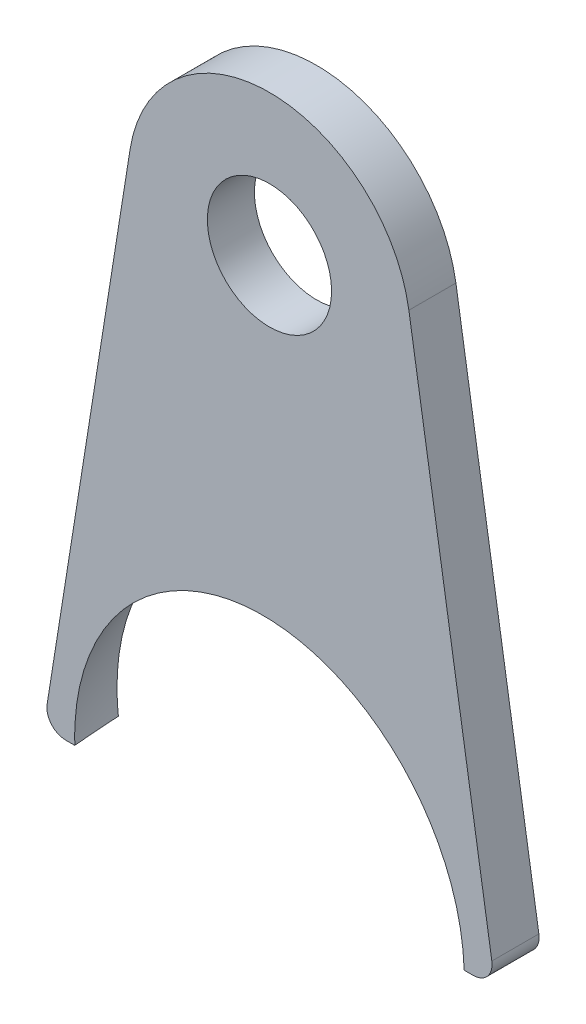
ISO-10303-21;
HEADER;
FILE_DESCRIPTION(('STEP AP214'),'2;1');
FILE_NAME('part.step','',(''),(''),'','','');
FILE_SCHEMA(('AUTOMOTIVE_DESIGN { 1 0 10303 214 1 1 1 1 }'));
ENDSEC;
DATA;
#1=APPLICATION_CONTEXT('core data for automotive mechanical design processes');
#2=APPLICATION_PROTOCOL_DEFINITION('international standard','automotive_design',2000,#1);
#3=PRODUCT_CONTEXT('',#1,'mechanical');
#4=PRODUCT('Part','Part','',(#3));
#5=PRODUCT_RELATED_PRODUCT_CATEGORY('part','',(#4));
#6=PRODUCT_DEFINITION_FORMATION('','',#4);
#7=PRODUCT_DEFINITION_CONTEXT('part definition',#1,'design');
#8=PRODUCT_DEFINITION('design','',#6,#7);
#9=PRODUCT_DEFINITION_SHAPE('','',#8);
#10=(LENGTH_UNIT() NAMED_UNIT(*) SI_UNIT(.MILLI.,.METRE.));
#11=(NAMED_UNIT(*) PLANE_ANGLE_UNIT() SI_UNIT($,.RADIAN.));
#12=(NAMED_UNIT(*) SI_UNIT($,.STERADIAN.) SOLID_ANGLE_UNIT());
#13=UNCERTAINTY_MEASURE_WITH_UNIT(LENGTH_MEASURE(1.E-05),#10,'distance_accuracy_value','');
#14=(GEOMETRIC_REPRESENTATION_CONTEXT(3) GLOBAL_UNCERTAINTY_ASSIGNED_CONTEXT((#13)) GLOBAL_UNIT_ASSIGNED_CONTEXT((#10,
#11,#12)) REPRESENTATION_CONTEXT('',''));
#15=CARTESIAN_POINT('',(0.,0.,0.));
#16=DIRECTION('',(0.,0.,1.));
#17=DIRECTION('',(1.,0.,0.));
#18=AXIS2_PLACEMENT_3D('',#15,#16,#17);
#19=CARTESIAN_POINT('',(0.,-35.211766,-3.175));
#20=DIRECTION('',(0.,1.,0.));
#21=DIRECTION('',(-1.,0.,0.));
#22=AXIS2_PLACEMENT_3D('',#19,#20,#21);
#23=PLANE('',#22);
#24=DIRECTION('',(1.,0.,0.));
#25=VECTOR('',#24,1.);
#26=CARTESIAN_POINT('',(0.,-35.211766,0.));
#27=LINE('',#26,#25);
#28=CARTESIAN_POINT('',(13.1394340026446,-35.211766,0.));
#29=VERTEX_POINT('',#28);
#30=CARTESIAN_POINT('',(13.7522496650488,-35.211766,0.));
#31=VERTEX_POINT('',#30);
#32=EDGE_CURVE('E131',#29,#31,#27,.T.);
#33=ORIENTED_EDGE('',*,*,#32,.F.);
#34=CARTESIAN_POINT('',(0.00476535947638301,-35.211766,0.0475119253614542));
#35=DIRECTION('',(0.,-1.,0.));
#36=DIRECTION('',(0.0997974651310145,0.,0.995007771805539));
#37=AXIS2_PLACEMENT_3D('',#34,#35,#36);
#38=ELLIPSE('',#37,38.1911531206193,13.081);
#39=CARTESIAN_POINT('',(12.8114151936818,-35.211766,-3.175));
#40=VERTEX_POINT('',#39);
#41=EDGE_CURVE('E114',#29,#40,#38,.F.);
#42=ORIENTED_EDGE('',*,*,#41,.T.);
#43=DIRECTION('',(1.,0.,0.));
#44=VECTOR('',#43,1.);
#45=CARTESIAN_POINT('',(0.,-35.211766,-3.175));
#46=LINE('',#45,#44);
#47=CARTESIAN_POINT('',(13.7522496650488,-35.211766,-3.175));
#48=VERTEX_POINT('',#47);
#49=EDGE_CURVE('E178',#40,#48,#46,.T.);
#50=ORIENTED_EDGE('',*,*,#49,.T.);
#51=DIRECTION('',(0.,0.,1.));
#52=VECTOR('',#51,1.);
#53=CARTESIAN_POINT('',(13.7522496650488,-35.211766,-3.175));
#54=LINE('',#53,#52);
#55=EDGE_CURVE('E11',#31,#48,#54,.F.);
#56=ORIENTED_EDGE('',*,*,#55,.F.);
#57=EDGE_LOOP('',(#33,#42,#50,#56));
#58=FACE_BOUND('',#57,.T.);
#59=ADVANCED_FACE('F43',(#58),#23,.F.);
#60=CARTESIAN_POINT('',(-9.40696698253595,1.49485691271059,-3.175));
#61=DIRECTION('',(-0.987608082156004,0.156940358289825,0.));
#62=DIRECTION('',(-0.156940358289825,-0.987608082156004,0.));
#63=AXIS2_PLACEMENT_3D('',#60,#61,#62);
#64=PLANE('',#63);
#65=DIRECTION('',(0.156940358289825,0.987608082156004,0.));
#66=VECTOR('',#65,1.);
#67=CARTESIAN_POINT('',(-9.40696698253595,1.49485691271059,0.));
#68=LINE('',#67,#66);
#69=CARTESIAN_POINT('',(-15.006511929387,-33.7424517449719,0.));
#70=VERTEX_POINT('',#69);
#71=CARTESIAN_POINT('',(-9.40696698253595,1.49485691271059,0.));
#72=VERTEX_POINT('',#71);
#73=EDGE_CURVE('E138',#70,#72,#68,.T.);
#74=ORIENTED_EDGE('',*,*,#73,.T.);
#75=DIRECTION('',(0.,0.,1.));
#76=VECTOR('',#75,1.);
#77=CARTESIAN_POINT('',(-9.40696698253595,1.49485691271059,-3.175));
#78=LINE('',#77,#76);
#79=CARTESIAN_POINT('',(-9.40696698253595,1.49485691271059,-3.175));
#80=VERTEX_POINT('',#79);
#81=EDGE_CURVE('E129',#80,#72,#78,.T.);
#82=ORIENTED_EDGE('',*,*,#81,.F.);
#83=DIRECTION('',(0.156940358289825,0.987608082156004,0.));
#84=VECTOR('',#83,1.);
#85=CARTESIAN_POINT('',(-9.40696698253595,1.49485691271059,-3.175));
#86=LINE('',#85,#84);
#87=CARTESIAN_POINT('',(-15.006511929387,-33.7424517449719,-3.175));
#88=VERTEX_POINT('',#87);
#89=EDGE_CURVE('E179',#88,#80,#86,.T.);
#90=ORIENTED_EDGE('',*,*,#89,.F.);
#91=DIRECTION('',(0.,0.,1.));
#92=VECTOR('',#91,1.);
#93=CARTESIAN_POINT('',(-15.006511929387,-33.7424517449719,-3.175));
#94=LINE('',#93,#92);
#95=EDGE_CURVE('E151',#70,#88,#94,.F.);
#96=ORIENTED_EDGE('',*,*,#95,.F.);
#97=EDGE_LOOP('',(#74,#82,#90,#96));
#98=FACE_BOUND('',#97,.T.);
#99=ADVANCED_FACE('F189',(#98),#64,.T.);
#100=CARTESIAN_POINT('',(-13.7522496650488,-35.211766,-3.175));
#101=VERTEX_POINT('',#100);
#102=CARTESIAN_POINT('',(-13.3718002828236,-35.211766,-3.175));
#103=VERTEX_POINT('',#102);
#104=EDGE_CURVE('E134',#101,#103,#46,.T.);
#105=ORIENTED_EDGE('',*,*,#104,.T.);
#106=CARTESIAN_POINT('',(-13.1383059825689,-35.211766,0.));
#107=VERTEX_POINT('',#106);
#108=EDGE_CURVE('E111',#103,#107,#38,.F.);
#109=ORIENTED_EDGE('',*,*,#108,.T.);
#110=CARTESIAN_POINT('',(-13.7522496650488,-35.211766,0.));
#111=VERTEX_POINT('',#110);
#112=EDGE_CURVE('E120',#111,#107,#27,.T.);
#113=ORIENTED_EDGE('',*,*,#112,.F.);
#114=DIRECTION('',(0.,0.,1.));
#115=VECTOR('',#114,1.);
#116=CARTESIAN_POINT('',(-13.7522496650488,-35.211766,0.));
#117=LINE('',#116,#115);
#118=EDGE_CURVE('E142',#101,#111,#117,.T.);
#119=ORIENTED_EDGE('',*,*,#118,.F.);
#120=EDGE_LOOP('',(#105,#109,#113,#119));
#121=FACE_BOUND('',#120,.T.);
#122=ADVANCED_FACE('F132',(#121),#23,.F.);
#123=CARTESIAN_POINT('',(9.40696698253595,1.49485691271059,-3.175));
#124=DIRECTION('',(-0.987608082156004,-0.156940358289826,0.));
#125=DIRECTION('',(0.156940358289826,-0.987608082156004,0.));
#126=AXIS2_PLACEMENT_3D('',#123,#124,#125);
#127=PLANE('',#126);
#128=DIRECTION('',(-0.156940358289826,0.987608082156004,0.));
#129=VECTOR('',#128,1.);
#130=CARTESIAN_POINT('',(9.40696698253595,1.49485691271059,-3.175));
#131=LINE('',#130,#129);
#132=CARTESIAN_POINT('',(15.006511929387,-33.7424517449719,-3.175));
#133=VERTEX_POINT('',#132);
#134=CARTESIAN_POINT('',(9.40696698253595,1.49485691271059,-3.175));
#135=VERTEX_POINT('',#134);
#136=EDGE_CURVE('E176',#133,#135,#131,.T.);
#137=ORIENTED_EDGE('',*,*,#136,.T.);
#138=DIRECTION('',(0.,0.,1.));
#139=VECTOR('',#138,1.);
#140=CARTESIAN_POINT('',(9.40696698253595,1.49485691271059,-3.175));
#141=LINE('',#140,#139);
#142=CARTESIAN_POINT('',(9.40696698253595,1.49485691271059,0.));
#143=VERTEX_POINT('',#142);
#144=EDGE_CURVE('E164',#135,#143,#141,.T.);
#145=ORIENTED_EDGE('',*,*,#144,.T.);
#146=DIRECTION('',(-0.156940358289826,0.987608082156004,0.));
#147=VECTOR('',#146,1.);
#148=CARTESIAN_POINT('',(9.40696698253595,1.49485691271059,0.));
#149=LINE('',#148,#147);
#150=CARTESIAN_POINT('',(15.006511929387,-33.7424517449719,0.));
#151=VERTEX_POINT('',#150);
#152=EDGE_CURVE('E128',#151,#143,#149,.T.);
#153=ORIENTED_EDGE('',*,*,#152,.F.);
#154=DIRECTION('',(0.,0.,1.));
#155=VECTOR('',#154,1.);
#156=CARTESIAN_POINT('',(15.006511929387,-33.7424517449719,-3.175));
#157=LINE('',#156,#155);
#158=EDGE_CURVE('E51',#133,#151,#157,.T.);
#159=ORIENTED_EDGE('',*,*,#158,.F.);
#160=EDGE_LOOP('',(#137,#145,#153,#159));
#161=FACE_BOUND('',#160,.T.);
#162=ADVANCED_FACE('F162',(#161),#127,.F.);
#163=CARTESIAN_POINT('',(0.,0.,-3.175));
#164=DIRECTION('',(0.,0.,1.));
#165=DIRECTION('',(-1.,0.,0.));
#166=AXIS2_PLACEMENT_3D('',#163,#164,#165);
#167=CYLINDRICAL_SURFACE('',#166,9.525);
#168=CARTESIAN_POINT('',(0.,0.,0.));
#169=DIRECTION('',(0.,0.,1.));
#170=DIRECTION('',(1.,0.,0.));
#171=AXIS2_PLACEMENT_3D('',#168,#169,#170);
#172=CIRCLE('',#171,9.525);
#173=EDGE_CURVE('E165',#143,#72,#172,.T.);
#174=ORIENTED_EDGE('',*,*,#173,.F.);
#175=ORIENTED_EDGE('',*,*,#144,.F.);
#176=CARTESIAN_POINT('',(0.,0.,-3.175));
#177=DIRECTION('',(0.,0.,1.));
#178=DIRECTION('',(1.,0.,0.));
#179=AXIS2_PLACEMENT_3D('',#176,#177,#178);
#180=CIRCLE('',#179,9.525);
#181=EDGE_CURVE('E171',#135,#80,#180,.T.);
#182=ORIENTED_EDGE('',*,*,#181,.T.);
#183=ORIENTED_EDGE('',*,*,#81,.T.);
#184=EDGE_LOOP('',(#174,#175,#182,#183));
#185=FACE_BOUND('',#184,.T.);
#186=ADVANCED_FACE('F194',(#185),#167,.T.);
#187=CARTESIAN_POINT('',(0.,0.,-3.175));
#188=DIRECTION('',(0.,0.,1.));
#189=DIRECTION('',(-1.,0.,0.));
#190=AXIS2_PLACEMENT_3D('',#187,#188,#189);
#191=CYLINDRICAL_SURFACE('',#190,4.191);
#192=CARTESIAN_POINT('',(0.,0.,-3.175));
#193=DIRECTION('',(0.,0.,1.));
#194=DIRECTION('',(1.,0.,0.));
#195=AXIS2_PLACEMENT_3D('',#192,#193,#194);
#196=CIRCLE('',#195,4.191);
#197=CARTESIAN_POINT('',(4.191,0.,-3.175));
#198=VERTEX_POINT('',#197);
#199=EDGE_CURVE('E172',#198,#198,#196,.T.);
#200=ORIENTED_EDGE('',*,*,#199,.F.);
#201=EDGE_LOOP('',(#200));
#202=FACE_BOUND('',#201,.T.);
#203=CARTESIAN_POINT('',(0.,0.,0.));
#204=DIRECTION('',(0.,0.,1.));
#205=DIRECTION('',(1.,0.,0.));
#206=AXIS2_PLACEMENT_3D('',#203,#204,#205);
#207=CIRCLE('',#206,4.191);
#208=CARTESIAN_POINT('',(4.191,0.,0.));
#209=VERTEX_POINT('',#208);
#210=EDGE_CURVE('E135',#209,#209,#207,.T.);
#211=ORIENTED_EDGE('',*,*,#210,.T.);
#212=EDGE_LOOP('',(#211));
#213=FACE_BOUND('',#212,.T.);
#214=ADVANCED_FACE('F196',(#202,#213),#191,.F.);
#215=CARTESIAN_POINT('',(0.,0.,-3.175));
#216=DIRECTION('',(0.,0.,-1.));
#217=DIRECTION('',(1.,0.,0.));
#218=AXIS2_PLACEMENT_3D('',#215,#216,#217);
#219=PLANE('',#218);
#220=ORIENTED_EDGE('',*,*,#89,.T.);
#221=ORIENTED_EDGE('',*,*,#181,.F.);
#222=ORIENTED_EDGE('',*,*,#136,.F.);
#223=CARTESIAN_POINT('',(13.7522496650488,-33.941766,-3.175));
#224=DIRECTION('',(0.,0.,1.));
#225=DIRECTION('',(1.,0.,0.));
#226=AXIS2_PLACEMENT_3D('',#223,#224,#225);
#227=CIRCLE('',#226,1.27);
#228=EDGE_CURVE('E57',#48,#133,#227,.T.);
#229=ORIENTED_EDGE('',*,*,#228,.F.);
#230=ORIENTED_EDGE('',*,*,#49,.F.);
#231=CARTESIAN_POINT('',(-0.318446710437376,-34.0310551677843,-3.17500000000004));
#232=DIRECTION('',(0.,0.,1.));
#233=DIRECTION('',(0.264029713717794,-0.964514546429498,0.));
#234=AXIS2_PLACEMENT_3D('',#231,#232,#233);
#235=ELLIPSE('',#234,13.9930306632658,13.081);
#236=EDGE_CURVE('E181',#103,#40,#235,.F.);
#237=ORIENTED_EDGE('',*,*,#236,.F.);
#238=ORIENTED_EDGE('',*,*,#104,.F.);
#239=CARTESIAN_POINT('',(-13.7522496650488,-33.941766,-3.175));
#240=DIRECTION('',(0.,0.,1.));
#241=DIRECTION('',(1.,0.,0.));
#242=AXIS2_PLACEMENT_3D('',#239,#240,#241);
#243=CIRCLE('',#242,1.27);
#244=EDGE_CURVE('E155',#88,#101,#243,.T.);
#245=ORIENTED_EDGE('',*,*,#244,.F.);
#246=EDGE_LOOP('',(#220,#221,#222,#229,#230,#237,#238,#245));
#247=FACE_BOUND('',#246,.T.);
#248=ORIENTED_EDGE('',*,*,#199,.T.);
#249=EDGE_LOOP('',(#248));
#250=FACE_BOUND('',#249,.T.);
#251=ADVANCED_FACE('F182',(#247,#250),#219,.T.);
#252=CARTESIAN_POINT('',(0.,0.,0.));
#253=DIRECTION('',(0.,0.,-1.));
#254=DIRECTION('',(1.,0.,0.));
#255=AXIS2_PLACEMENT_3D('',#252,#253,#254);
#256=PLANE('',#255);
#257=ORIENTED_EDGE('',*,*,#112,.T.);
#258=CARTESIAN_POINT('',(-1.11022302462516E-13,-35.1943578891123,0.));
#259=DIRECTION('',(0.,0.,1.));
#260=DIRECTION('',(0.264029713717794,-0.964514546429498,0.));
#261=AXIS2_PLACEMENT_3D('',#258,#259,#260);
#262=ELLIPSE('',#261,13.9930306632658,13.081);
#263=EDGE_CURVE('E107',#107,#29,#262,.F.);
#264=ORIENTED_EDGE('',*,*,#263,.T.);
#265=ORIENTED_EDGE('',*,*,#32,.T.);
#266=CARTESIAN_POINT('',(13.7522496650488,-33.941766,0.));
#267=DIRECTION('',(0.,0.,1.));
#268=DIRECTION('',(1.,0.,0.));
#269=AXIS2_PLACEMENT_3D('',#266,#267,#268);
#270=CIRCLE('',#269,1.27);
#271=EDGE_CURVE('E145',#151,#31,#270,.F.);
#272=ORIENTED_EDGE('',*,*,#271,.F.);
#273=ORIENTED_EDGE('',*,*,#152,.T.);
#274=ORIENTED_EDGE('',*,*,#173,.T.);
#275=ORIENTED_EDGE('',*,*,#73,.F.);
#276=CARTESIAN_POINT('',(-13.7522496650488,-33.941766,0.));
#277=DIRECTION('',(0.,0.,1.));
#278=DIRECTION('',(1.,0.,0.));
#279=AXIS2_PLACEMENT_3D('',#276,#277,#278);
#280=CIRCLE('',#279,1.27);
#281=EDGE_CURVE('E124',#111,#70,#280,.F.);
#282=ORIENTED_EDGE('',*,*,#281,.F.);
#283=EDGE_LOOP('',(#257,#264,#265,#272,#273,#274,#275,#282));
#284=FACE_BOUND('',#283,.T.);
#285=ORIENTED_EDGE('',*,*,#210,.F.);
#286=EDGE_LOOP('',(#285));
#287=FACE_BOUND('',#286,.T.);
#288=ADVANCED_FACE('F121',(#284,#287),#256,.F.);
#289=CARTESIAN_POINT('',(-68.993899624417,216.844016374224,-687.887876143375));
#290=DIRECTION('',(0.0937609927809066,-0.342513879030733,0.934822506631103));
#291=DIRECTION('',(0.902184120214388,-0.367856186909635,-0.225267927111905));
#292=AXIS2_PLACEMENT_3D('',#289,#290,#291);
#293=CYLINDRICAL_SURFACE('',#292,13.081);
#294=ORIENTED_EDGE('',*,*,#108,.F.);
#295=ORIENTED_EDGE('',*,*,#236,.T.);
#296=ORIENTED_EDGE('',*,*,#41,.F.);
#297=ORIENTED_EDGE('',*,*,#263,.F.);
#298=EDGE_LOOP('',(#294,#295,#296,#297));
#299=FACE_BOUND('',#298,.T.);
#300=ADVANCED_FACE('F109',(#299),#293,.F.);
#301=CARTESIAN_POINT('',(-13.7522496650488,-33.941766,-3.175));
#302=DIRECTION('',(0.,0.,-1.));
#303=DIRECTION('',(1.,0.,0.));
#304=AXIS2_PLACEMENT_3D('',#301,#302,#303);
#305=CYLINDRICAL_SURFACE('',#304,1.27);
#306=ORIENTED_EDGE('',*,*,#244,.T.);
#307=ORIENTED_EDGE('',*,*,#118,.T.);
#308=ORIENTED_EDGE('',*,*,#281,.T.);
#309=ORIENTED_EDGE('',*,*,#95,.T.);
#310=EDGE_LOOP('',(#306,#307,#308,#309));
#311=FACE_BOUND('',#310,.T.);
#312=ADVANCED_FACE('F187',(#311),#305,.T.);
#313=CARTESIAN_POINT('',(13.7522496650488,-33.941766,-3.175));
#314=DIRECTION('',(0.,0.,1.));
#315=DIRECTION('',(-1.,0.,0.));
#316=AXIS2_PLACEMENT_3D('',#313,#314,#315);
#317=CYLINDRICAL_SURFACE('',#316,1.27);
#318=ORIENTED_EDGE('',*,*,#228,.T.);
#319=ORIENTED_EDGE('',*,*,#158,.T.);
#320=ORIENTED_EDGE('',*,*,#271,.T.);
#321=ORIENTED_EDGE('',*,*,#55,.T.);
#322=EDGE_LOOP('',(#318,#319,#320,#321));
#323=FACE_BOUND('',#322,.T.);
#324=ADVANCED_FACE('F45',(#323),#317,.T.);
#325=CLOSED_SHELL('',(#59,#99,#122,#162,#186,#214,#251,#288,#300,#312,#324));
#326=MANIFOLD_SOLID_BREP('B2',#325);
#327=ADVANCED_BREP_SHAPE_REPRESENTATION('',(#18,#326),#14);
#328=SHAPE_DEFINITION_REPRESENTATION(#9,#327);
ENDSEC;
END-ISO-10303-21;
